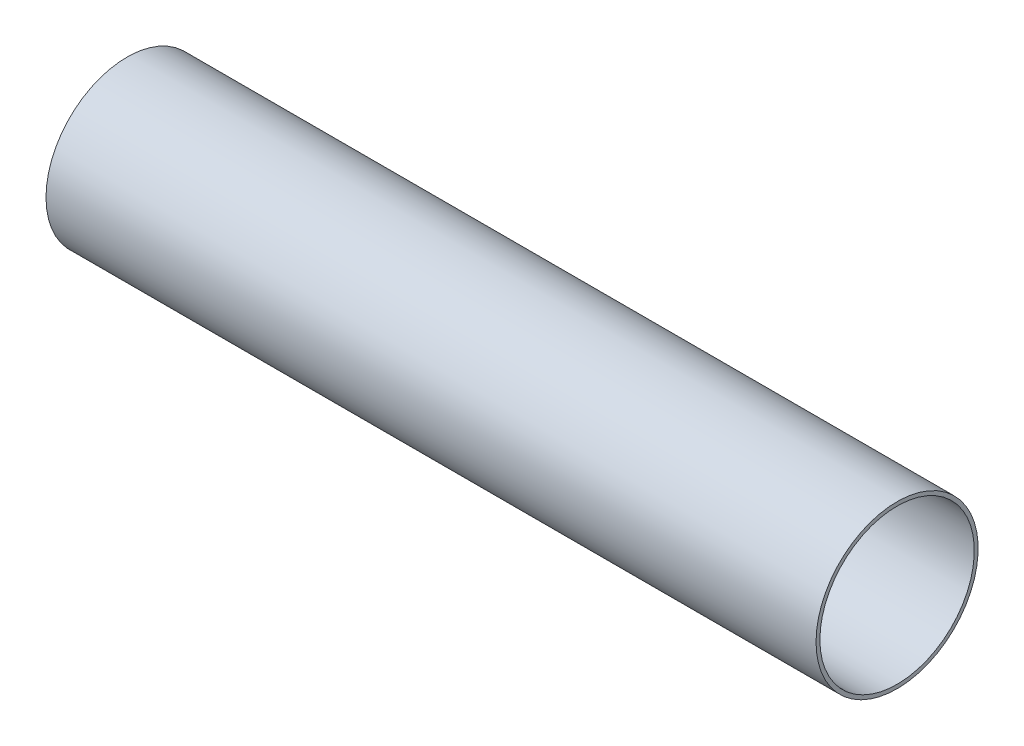
ISO-10303-21;
HEADER;
FILE_DESCRIPTION(('STEP AP214'),'2;1');
FILE_NAME('part.step','',(''),(''),'','','');
FILE_SCHEMA(('AUTOMOTIVE_DESIGN { 1 0 10303 214 1 1 1 1 }'));
ENDSEC;
DATA;
#1=APPLICATION_CONTEXT('core data for automotive mechanical design processes');
#2=APPLICATION_PROTOCOL_DEFINITION('international standard','automotive_design',2000,#1);
#3=PRODUCT_CONTEXT('',#1,'mechanical');
#4=PRODUCT('Part','Part','',(#3));
#5=PRODUCT_RELATED_PRODUCT_CATEGORY('part','',(#4));
#6=PRODUCT_DEFINITION_FORMATION('','',#4);
#7=PRODUCT_DEFINITION_CONTEXT('part definition',#1,'design');
#8=PRODUCT_DEFINITION('design','',#6,#7);
#9=PRODUCT_DEFINITION_SHAPE('','',#8);
#10=(LENGTH_UNIT() NAMED_UNIT(*) SI_UNIT(.MILLI.,.METRE.));
#11=(NAMED_UNIT(*) PLANE_ANGLE_UNIT() SI_UNIT($,.RADIAN.));
#12=(NAMED_UNIT(*) SI_UNIT($,.STERADIAN.) SOLID_ANGLE_UNIT());
#13=UNCERTAINTY_MEASURE_WITH_UNIT(LENGTH_MEASURE(1.E-05),#10,'distance_accuracy_value','');
#14=(GEOMETRIC_REPRESENTATION_CONTEXT(3) GLOBAL_UNCERTAINTY_ASSIGNED_CONTEXT((#13)) GLOBAL_UNIT_ASSIGNED_CONTEXT((#10,
#11,#12)) REPRESENTATION_CONTEXT('',''));
#15=CARTESIAN_POINT('',(0.,0.,0.));
#16=DIRECTION('',(0.,0.,1.));
#17=DIRECTION('',(1.,0.,0.));
#18=AXIS2_PLACEMENT_3D('',#15,#16,#17);
#19=CARTESIAN_POINT('',(965.2,0.,0.));
#20=DIRECTION('',(1.,0.,0.));
#21=DIRECTION('',(0.,0.,-1.));
#22=AXIS2_PLACEMENT_3D('',#19,#20,#21);
#23=PLANE('',#22);
#24=CARTESIAN_POINT('',(965.2,0.,0.));
#25=DIRECTION('',(1.,0.,0.));
#26=DIRECTION('',(0.,0.,-1.));
#27=AXIS2_PLACEMENT_3D('',#24,#25,#26);
#28=CIRCLE('',#27,101.6);
#29=CARTESIAN_POINT('',(965.2,0.,101.6));
#30=VERTEX_POINT('',#29);
#31=EDGE_CURVE('E10',#30,#30,#28,.T.);
#32=ORIENTED_EDGE('',*,*,#31,.T.);
#33=EDGE_LOOP('',(#32));
#34=FACE_BOUND('',#33,.T.);
#35=CARTESIAN_POINT('',(965.2,0.,0.));
#36=DIRECTION('',(1.,0.,0.));
#37=DIRECTION('',(0.,0.,-1.));
#38=AXIS2_PLACEMENT_3D('',#35,#36,#37);
#39=CIRCLE('',#38,96.774);
#40=CARTESIAN_POINT('',(965.2,0.,96.774));
#41=VERTEX_POINT('',#40);
#42=EDGE_CURVE('E42',#41,#41,#39,.T.);
#43=ORIENTED_EDGE('',*,*,#42,.F.);
#44=EDGE_LOOP('',(#43));
#45=FACE_BOUND('',#44,.T.);
#46=ADVANCED_FACE('F31',(#34,#45),#23,.T.);
#47=CARTESIAN_POINT('',(0.,0.,0.));
#48=DIRECTION('',(1.,0.,0.));
#49=DIRECTION('',(0.,0.,-1.));
#50=AXIS2_PLACEMENT_3D('',#47,#48,#49);
#51=PLANE('',#50);
#52=CARTESIAN_POINT('',(0.,0.,0.));
#53=DIRECTION('',(1.,0.,0.));
#54=DIRECTION('',(0.,0.,-1.));
#55=AXIS2_PLACEMENT_3D('',#52,#53,#54);
#56=CIRCLE('',#55,101.6);
#57=CARTESIAN_POINT('',(0.,0.,101.6));
#58=VERTEX_POINT('',#57);
#59=EDGE_CURVE('E35',#58,#58,#56,.T.);
#60=ORIENTED_EDGE('',*,*,#59,.F.);
#61=EDGE_LOOP('',(#60));
#62=FACE_BOUND('',#61,.T.);
#63=CARTESIAN_POINT('',(0.,0.,0.));
#64=DIRECTION('',(1.,0.,0.));
#65=DIRECTION('',(0.,0.,-1.));
#66=AXIS2_PLACEMENT_3D('',#63,#64,#65);
#67=CIRCLE('',#66,96.774);
#68=CARTESIAN_POINT('',(0.,0.,96.774));
#69=VERTEX_POINT('',#68);
#70=EDGE_CURVE('E44',#69,#69,#67,.T.);
#71=ORIENTED_EDGE('',*,*,#70,.T.);
#72=EDGE_LOOP('',(#71));
#73=FACE_BOUND('',#72,.T.);
#74=ADVANCED_FACE('F54',(#62,#73),#51,.F.);
#75=CARTESIAN_POINT('',(965.2,0.,0.));
#76=DIRECTION('',(-1.,0.,0.));
#77=DIRECTION('',(0.,0.,1.));
#78=AXIS2_PLACEMENT_3D('',#75,#76,#77);
#79=CYLINDRICAL_SURFACE('',#78,101.6);
#80=CARTESIAN_POINT('',(965.2,0.,101.6));
#81=CARTESIAN_POINT('',(955.145833333333,0.,101.6));
#82=CARTESIAN_POINT('',(945.091666666667,0.,101.6));
#83=CARTESIAN_POINT('',(924.983333333333,0.,101.6));
#84=CARTESIAN_POINT('',(914.929166666667,0.,101.6));
#85=CARTESIAN_POINT('',(894.820833333333,0.,101.6));
#86=CARTESIAN_POINT('',(884.766666666667,0.,101.6));
#87=CARTESIAN_POINT('',(864.658333333333,0.,101.6));
#88=CARTESIAN_POINT('',(854.604166666667,0.,101.6));
#89=CARTESIAN_POINT('',(834.495833333333,0.,101.6));
#90=CARTESIAN_POINT('',(824.441666666667,0.,101.6));
#91=CARTESIAN_POINT('',(804.333333333333,0.,101.6));
#92=CARTESIAN_POINT('',(794.279166666667,0.,101.6));
#93=CARTESIAN_POINT('',(774.170833333333,0.,101.6));
#94=CARTESIAN_POINT('',(764.116666666667,0.,101.6));
#95=CARTESIAN_POINT('',(744.008333333333,0.,101.6));
#96=CARTESIAN_POINT('',(733.954166666667,0.,101.6));
#97=CARTESIAN_POINT('',(713.845833333333,0.,101.6));
#98=CARTESIAN_POINT('',(703.791666666667,0.,101.6));
#99=CARTESIAN_POINT('',(683.683333333333,0.,101.6));
#100=CARTESIAN_POINT('',(673.629166666667,0.,101.6));
#101=CARTESIAN_POINT('',(653.520833333333,0.,101.6));
#102=CARTESIAN_POINT('',(643.466666666667,0.,101.6));
#103=CARTESIAN_POINT('',(623.358333333333,0.,101.6));
#104=CARTESIAN_POINT('',(613.304166666667,0.,101.6));
#105=CARTESIAN_POINT('',(593.195833333333,0.,101.6));
#106=CARTESIAN_POINT('',(583.141666666667,0.,101.6));
#107=CARTESIAN_POINT('',(563.033333333333,0.,101.6));
#108=CARTESIAN_POINT('',(552.979166666667,0.,101.6));
#109=CARTESIAN_POINT('',(532.870833333333,0.,101.6));
#110=CARTESIAN_POINT('',(522.816666666667,0.,101.6));
#111=CARTESIAN_POINT('',(502.708333333333,0.,101.6));
#112=CARTESIAN_POINT('',(492.654166666667,0.,101.6));
#113=CARTESIAN_POINT('',(472.545833333333,0.,101.6));
#114=CARTESIAN_POINT('',(462.491666666667,0.,101.6));
#115=CARTESIAN_POINT('',(442.383333333333,0.,101.6));
#116=CARTESIAN_POINT('',(432.329166666667,0.,101.6));
#117=CARTESIAN_POINT('',(412.220833333333,0.,101.6));
#118=CARTESIAN_POINT('',(402.166666666667,0.,101.6));
#119=CARTESIAN_POINT('',(382.058333333333,0.,101.6));
#120=CARTESIAN_POINT('',(372.004166666667,0.,101.6));
#121=CARTESIAN_POINT('',(351.895833333333,0.,101.6));
#122=CARTESIAN_POINT('',(341.841666666667,0.,101.6));
#123=CARTESIAN_POINT('',(321.733333333333,0.,101.6));
#124=CARTESIAN_POINT('',(311.679166666667,0.,101.6));
#125=CARTESIAN_POINT('',(291.570833333333,0.,101.6));
#126=CARTESIAN_POINT('',(281.516666666667,0.,101.6));
#127=CARTESIAN_POINT('',(261.408333333333,0.,101.6));
#128=CARTESIAN_POINT('',(251.354166666667,0.,101.6));
#129=CARTESIAN_POINT('',(231.245833333333,0.,101.6));
#130=CARTESIAN_POINT('',(221.191666666667,0.,101.6));
#131=CARTESIAN_POINT('',(201.083333333333,0.,101.6));
#132=CARTESIAN_POINT('',(191.029166666667,0.,101.6));
#133=CARTESIAN_POINT('',(170.920833333333,0.,101.6));
#134=CARTESIAN_POINT('',(160.866666666667,0.,101.6));
#135=CARTESIAN_POINT('',(140.758333333333,0.,101.6));
#136=CARTESIAN_POINT('',(130.704166666667,0.,101.6));
#137=CARTESIAN_POINT('',(110.595833333333,0.,101.6));
#138=CARTESIAN_POINT('',(100.541666666667,0.,101.6));
#139=CARTESIAN_POINT('',(80.4333333333334,0.,101.6));
#140=CARTESIAN_POINT('',(70.3791666666667,0.,101.6));
#141=CARTESIAN_POINT('',(50.2708333333333,0.,101.6));
#142=CARTESIAN_POINT('',(40.2166666666666,0.,101.6));
#143=CARTESIAN_POINT('',(20.1083333333333,0.,101.6));
#144=CARTESIAN_POINT('',(10.0541666666667,0.,101.6));
#145=CARTESIAN_POINT('',(0.,0.,101.6));
#146=B_SPLINE_CURVE_WITH_KNOTS('',3,(#80,#81,#82,#83,#84,#85,#86,#87,#88,#89,#90,#91,#92,#93,
#94,#95,#96,#97,#98,#99,#100,#101,#102,#103,#104,#105,#106,#107,#108,#109,#110,#111,#112,#113,
#114,#115,#116,#117,#118,#119,#120,#121,#122,#123,#124,#125,#126,#127,#128,#129,#130,#131,#132,
#133,#134,#135,#136,#137,#138,#139,#140,#141,#142,#143,#144,#145),.UNSPECIFIED.,.F.,.F.,(4,2,2,
2,2,2,2,2,2,2,2,2,2,2,2,2,2,2,2,2,2,2,2,2,2,2,2,2,2,2,2,2,4),(0.,30.1625000000001,
60.3250000000001,90.4875000000001,120.65,150.8125,180.975,211.1375,241.3,271.4625,301.625,
331.7875,361.95,392.1125,422.275,452.4375,482.6,512.7625,542.925,573.0875,603.25,633.4125,
663.575,693.7375,723.9,754.0625,784.225,814.3875,844.55,874.7125,904.875,935.0375,965.2),.UNSPECIFIED.);
#147=EDGE_CURVE('BSEAM33',#30,#58,#146,.T.);
#148=ORIENTED_EDGE('',*,*,#31,.F.);
#149=ORIENTED_EDGE('',*,*,#59,.T.);
#150=ORIENTED_EDGE('',*,*,#147,.T.);
#151=ORIENTED_EDGE('',*,*,#147,.F.);
#152=EDGE_LOOP('',(#148,#150,#149,#151));
#153=FACE_BOUND('',#152,.T.);
#154=ADVANCED_FACE('F33',(#153),#79,.T.);
#155=CARTESIAN_POINT('',(965.2,0.,0.));
#156=DIRECTION('',(-1.,0.,0.));
#157=DIRECTION('',(0.,0.,1.));
#158=AXIS2_PLACEMENT_3D('',#155,#156,#157);
#159=CYLINDRICAL_SURFACE('',#158,96.774);
#160=CARTESIAN_POINT('',(965.2,0.,96.774));
#161=CARTESIAN_POINT('',(955.145833333333,0.,96.774));
#162=CARTESIAN_POINT('',(945.091666666667,0.,96.774));
#163=CARTESIAN_POINT('',(924.983333333333,0.,96.774));
#164=CARTESIAN_POINT('',(914.929166666667,0.,96.774));
#165=CARTESIAN_POINT('',(894.820833333333,0.,96.774));
#166=CARTESIAN_POINT('',(884.766666666667,0.,96.774));
#167=CARTESIAN_POINT('',(864.658333333333,0.,96.774));
#168=CARTESIAN_POINT('',(854.604166666667,0.,96.774));
#169=CARTESIAN_POINT('',(834.495833333333,0.,96.774));
#170=CARTESIAN_POINT('',(824.441666666667,0.,96.774));
#171=CARTESIAN_POINT('',(804.333333333333,0.,96.774));
#172=CARTESIAN_POINT('',(794.279166666667,0.,96.774));
#173=CARTESIAN_POINT('',(774.170833333333,0.,96.774));
#174=CARTESIAN_POINT('',(764.116666666667,0.,96.774));
#175=CARTESIAN_POINT('',(744.008333333333,0.,96.774));
#176=CARTESIAN_POINT('',(733.954166666667,0.,96.774));
#177=CARTESIAN_POINT('',(713.845833333333,0.,96.774));
#178=CARTESIAN_POINT('',(703.791666666667,0.,96.774));
#179=CARTESIAN_POINT('',(683.683333333333,0.,96.774));
#180=CARTESIAN_POINT('',(673.629166666667,0.,96.774));
#181=CARTESIAN_POINT('',(653.520833333333,0.,96.774));
#182=CARTESIAN_POINT('',(643.466666666667,0.,96.774));
#183=CARTESIAN_POINT('',(623.358333333333,0.,96.774));
#184=CARTESIAN_POINT('',(613.304166666667,0.,96.774));
#185=CARTESIAN_POINT('',(593.195833333333,0.,96.774));
#186=CARTESIAN_POINT('',(583.141666666667,0.,96.774));
#187=CARTESIAN_POINT('',(563.033333333333,0.,96.774));
#188=CARTESIAN_POINT('',(552.979166666667,0.,96.774));
#189=CARTESIAN_POINT('',(532.870833333333,0.,96.774));
#190=CARTESIAN_POINT('',(522.816666666667,0.,96.774));
#191=CARTESIAN_POINT('',(502.708333333333,0.,96.774));
#192=CARTESIAN_POINT('',(492.654166666667,0.,96.774));
#193=CARTESIAN_POINT('',(472.545833333333,0.,96.774));
#194=CARTESIAN_POINT('',(462.491666666667,0.,96.774));
#195=CARTESIAN_POINT('',(442.383333333333,0.,96.774));
#196=CARTESIAN_POINT('',(432.329166666667,0.,96.774));
#197=CARTESIAN_POINT('',(412.220833333333,0.,96.774));
#198=CARTESIAN_POINT('',(402.166666666667,0.,96.774));
#199=CARTESIAN_POINT('',(382.058333333333,0.,96.774));
#200=CARTESIAN_POINT('',(372.004166666667,0.,96.774));
#201=CARTESIAN_POINT('',(351.895833333333,0.,96.774));
#202=CARTESIAN_POINT('',(341.841666666667,0.,96.774));
#203=CARTESIAN_POINT('',(321.733333333333,0.,96.774));
#204=CARTESIAN_POINT('',(311.679166666667,0.,96.774));
#205=CARTESIAN_POINT('',(291.570833333333,0.,96.774));
#206=CARTESIAN_POINT('',(281.516666666667,0.,96.774));
#207=CARTESIAN_POINT('',(261.408333333333,0.,96.774));
#208=CARTESIAN_POINT('',(251.354166666667,0.,96.774));
#209=CARTESIAN_POINT('',(231.245833333333,0.,96.774));
#210=CARTESIAN_POINT('',(221.191666666667,0.,96.774));
#211=CARTESIAN_POINT('',(201.083333333333,0.,96.774));
#212=CARTESIAN_POINT('',(191.029166666667,0.,96.774));
#213=CARTESIAN_POINT('',(170.920833333333,0.,96.774));
#214=CARTESIAN_POINT('',(160.866666666667,0.,96.774));
#215=CARTESIAN_POINT('',(140.758333333333,0.,96.774));
#216=CARTESIAN_POINT('',(130.704166666667,0.,96.774));
#217=CARTESIAN_POINT('',(110.595833333333,0.,96.774));
#218=CARTESIAN_POINT('',(100.541666666667,0.,96.774));
#219=CARTESIAN_POINT('',(80.4333333333334,0.,96.774));
#220=CARTESIAN_POINT('',(70.3791666666667,0.,96.774));
#221=CARTESIAN_POINT('',(50.2708333333333,0.,96.774));
#222=CARTESIAN_POINT('',(40.2166666666666,0.,96.774));
#223=CARTESIAN_POINT('',(20.1083333333333,0.,96.774));
#224=CARTESIAN_POINT('',(10.0541666666667,0.,96.774));
#225=CARTESIAN_POINT('',(0.,0.,96.774));
#226=B_SPLINE_CURVE_WITH_KNOTS('',3,(#160,#161,#162,#163,#164,#165,#166,#167,#168,#169,#170,
#171,#172,#173,#174,#175,#176,#177,#178,#179,#180,#181,#182,#183,#184,#185,#186,#187,#188,#189,
#190,#191,#192,#193,#194,#195,#196,#197,#198,#199,#200,#201,#202,#203,#204,#205,#206,#207,#208,
#209,#210,#211,#212,#213,#214,#215,#216,#217,#218,#219,#220,#221,#222,#223,#224,#225),
.UNSPECIFIED.,.F.,.F.,(4,2,2,2,2,2,2,2,2,2,2,2,2,2,2,2,2,2,2,2,2,2,2,2,2,2,2,2,2,2,2,2,4),(0.,
30.1625000000001,60.3250000000001,90.4875000000001,120.65,150.8125,180.975,211.1375,241.3,
271.4625,301.625,331.7875,361.95,392.1125,422.275,452.4375,482.6,512.7625,542.925,573.0875,
603.25,633.4125,663.575,693.7375,723.9,754.0625,784.225,814.3875,844.55,874.7125,904.875,
935.0375,965.2),.UNSPECIFIED.);
#227=EDGE_CURVE('BSEAM50',#41,#69,#226,.T.);
#228=ORIENTED_EDGE('',*,*,#42,.T.);
#229=ORIENTED_EDGE('',*,*,#70,.F.);
#230=ORIENTED_EDGE('',*,*,#227,.T.);
#231=ORIENTED_EDGE('',*,*,#227,.F.);
#232=EDGE_LOOP('',(#228,#230,#229,#231));
#233=FACE_BOUND('',#232,.T.);
#234=ADVANCED_FACE('F50',(#233),#159,.F.);
#235=CLOSED_SHELL('',(#46,#74,#154,#234));
#236=MANIFOLD_SOLID_BREP('B2',#235);
#237=ADVANCED_BREP_SHAPE_REPRESENTATION('',(#18,#236),#14);
#238=SHAPE_DEFINITION_REPRESENTATION(#9,#237);
ENDSEC;
END-ISO-10303-21;
